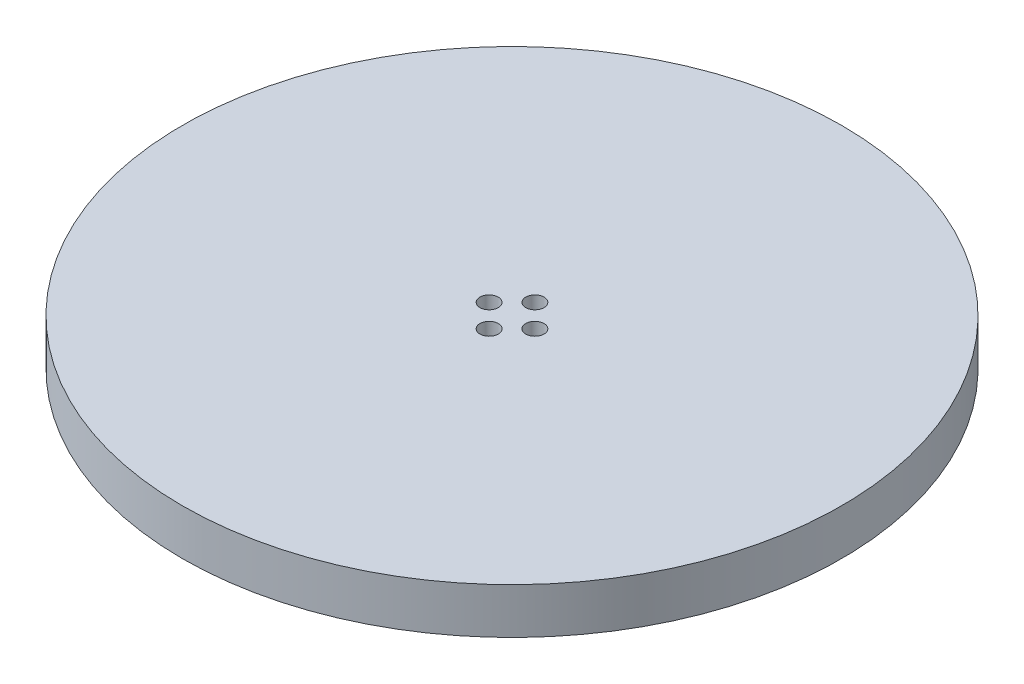
ISO-10303-21;
HEADER;
FILE_DESCRIPTION(('STEP AP214'),'2;1');
FILE_NAME('part.step','',(''),(''),'','','');
FILE_SCHEMA(('AUTOMOTIVE_DESIGN { 1 0 10303 214 1 1 1 1 }'));
ENDSEC;
DATA;
#1=APPLICATION_CONTEXT('core data for automotive mechanical design processes');
#2=APPLICATION_PROTOCOL_DEFINITION('international standard','automotive_design',2000,#1);
#3=PRODUCT_CONTEXT('',#1,'mechanical');
#4=PRODUCT('Part','Part','',(#3));
#5=PRODUCT_RELATED_PRODUCT_CATEGORY('part','',(#4));
#6=PRODUCT_DEFINITION_FORMATION('','',#4);
#7=PRODUCT_DEFINITION_CONTEXT('part definition',#1,'design');
#8=PRODUCT_DEFINITION('design','',#6,#7);
#9=PRODUCT_DEFINITION_SHAPE('','',#8);
#10=(LENGTH_UNIT() NAMED_UNIT(*) SI_UNIT(.MILLI.,.METRE.));
#11=(NAMED_UNIT(*) PLANE_ANGLE_UNIT() SI_UNIT($,.RADIAN.));
#12=(NAMED_UNIT(*) SI_UNIT($,.STERADIAN.) SOLID_ANGLE_UNIT());
#13=UNCERTAINTY_MEASURE_WITH_UNIT(LENGTH_MEASURE(1.E-05),#10,'distance_accuracy_value','');
#14=(GEOMETRIC_REPRESENTATION_CONTEXT(3) GLOBAL_UNCERTAINTY_ASSIGNED_CONTEXT((#13)) GLOBAL_UNIT_ASSIGNED_CONTEXT((#10,
#11,#12)) REPRESENTATION_CONTEXT('',''));
#15=CARTESIAN_POINT('',(0.,0.,0.));
#16=DIRECTION('',(0.,0.,1.));
#17=DIRECTION('',(1.,0.,0.));
#18=AXIS2_PLACEMENT_3D('',#15,#16,#17);
#19=CARTESIAN_POINT('',(-5.,10.,0.));
#20=DIRECTION('',(0.,-1.,0.));
#21=DIRECTION('',(0.,0.,-1.));
#22=AXIS2_PLACEMENT_3D('',#19,#20,#21);
#23=CYLINDRICAL_SURFACE('',#22,2.);
#24=CARTESIAN_POINT('',(-5.,10.,0.));
#25=DIRECTION('',(0.,1.,0.));
#26=DIRECTION('',(0.,0.,1.));
#27=AXIS2_PLACEMENT_3D('',#24,#25,#26);
#28=CIRCLE('',#27,2.);
#29=CARTESIAN_POINT('',(-5.,10.,2.));
#30=VERTEX_POINT('',#29);
#31=EDGE_CURVE('E39',#30,#30,#28,.T.);
#32=ORIENTED_EDGE('',*,*,#31,.T.);
#33=EDGE_LOOP('',(#32));
#34=FACE_BOUND('',#33,.T.);
#35=CARTESIAN_POINT('',(-5.,0.,0.));
#36=DIRECTION('',(0.,1.,0.));
#37=DIRECTION('',(0.,0.,1.));
#38=AXIS2_PLACEMENT_3D('',#35,#36,#37);
#39=CIRCLE('',#38,2.);
#40=CARTESIAN_POINT('',(-5.,0.,2.));
#41=VERTEX_POINT('',#40);
#42=EDGE_CURVE('E56',#41,#41,#39,.T.);
#43=ORIENTED_EDGE('',*,*,#42,.F.);
#44=EDGE_LOOP('',(#43));
#45=FACE_BOUND('',#44,.T.);
#46=ADVANCED_FACE('F31',(#34,#45),#23,.F.);
#47=CARTESIAN_POINT('',(0.,10.,0.));
#48=DIRECTION('',(0.,-1.,0.));
#49=DIRECTION('',(0.,0.,-1.));
#50=AXIS2_PLACEMENT_3D('',#47,#48,#49);
#51=CYLINDRICAL_SURFACE('',#50,72.);
#52=CARTESIAN_POINT('',(0.,10.,0.));
#53=DIRECTION('',(0.,1.,0.));
#54=DIRECTION('',(0.,0.,1.));
#55=AXIS2_PLACEMENT_3D('',#52,#53,#54);
#56=CIRCLE('',#55,72.);
#57=CARTESIAN_POINT('',(0.,10.,72.));
#58=VERTEX_POINT('',#57);
#59=EDGE_CURVE('E44',#58,#58,#56,.T.);
#60=ORIENTED_EDGE('',*,*,#59,.F.);
#61=EDGE_LOOP('',(#60));
#62=FACE_BOUND('',#61,.T.);
#63=CARTESIAN_POINT('',(0.,0.,0.));
#64=DIRECTION('',(0.,1.,0.));
#65=DIRECTION('',(0.,0.,1.));
#66=AXIS2_PLACEMENT_3D('',#63,#64,#65);
#67=CIRCLE('',#66,72.);
#68=CARTESIAN_POINT('',(0.,0.,72.));
#69=VERTEX_POINT('',#68);
#70=EDGE_CURVE('E54',#69,#69,#67,.T.);
#71=ORIENTED_EDGE('',*,*,#70,.T.);
#72=EDGE_LOOP('',(#71));
#73=FACE_BOUND('',#72,.T.);
#74=ADVANCED_FACE('F77',(#62,#73),#51,.T.);
#75=CARTESIAN_POINT('',(0.,10.,5.));
#76=DIRECTION('',(0.,-1.,0.));
#77=DIRECTION('',(0.,0.,-1.));
#78=AXIS2_PLACEMENT_3D('',#75,#76,#77);
#79=CYLINDRICAL_SURFACE('',#78,2.);
#80=CARTESIAN_POINT('',(0.,10.,5.));
#81=DIRECTION('',(0.,1.,0.));
#82=DIRECTION('',(0.,0.,1.));
#83=AXIS2_PLACEMENT_3D('',#80,#81,#82);
#84=CIRCLE('',#83,2.);
#85=CARTESIAN_POINT('',(0.,10.,7.));
#86=VERTEX_POINT('',#85);
#87=EDGE_CURVE('E65',#86,#86,#84,.T.);
#88=ORIENTED_EDGE('',*,*,#87,.T.);
#89=EDGE_LOOP('',(#88));
#90=FACE_BOUND('',#89,.T.);
#91=CARTESIAN_POINT('',(0.,0.,5.));
#92=DIRECTION('',(0.,1.,0.));
#93=DIRECTION('',(0.,0.,1.));
#94=AXIS2_PLACEMENT_3D('',#91,#92,#93);
#95=CIRCLE('',#94,2.);
#96=CARTESIAN_POINT('',(0.,0.,7.));
#97=VERTEX_POINT('',#96);
#98=EDGE_CURVE('E51',#97,#97,#95,.T.);
#99=ORIENTED_EDGE('',*,*,#98,.F.);
#100=EDGE_LOOP('',(#99));
#101=FACE_BOUND('',#100,.T.);
#102=ADVANCED_FACE('F80',(#90,#101),#79,.F.);
#103=CARTESIAN_POINT('',(0.,10.,-5.));
#104=DIRECTION('',(0.,-1.,0.));
#105=DIRECTION('',(0.,0.,-1.));
#106=AXIS2_PLACEMENT_3D('',#103,#104,#105);
#107=CYLINDRICAL_SURFACE('',#106,2.);
#108=CARTESIAN_POINT('',(0.,10.,-5.));
#109=DIRECTION('',(0.,1.,0.));
#110=DIRECTION('',(0.,0.,1.));
#111=AXIS2_PLACEMENT_3D('',#108,#109,#110);
#112=CIRCLE('',#111,2.);
#113=CARTESIAN_POINT('',(0.,10.,-3.));
#114=VERTEX_POINT('',#113);
#115=EDGE_CURVE('E61',#114,#114,#112,.T.);
#116=ORIENTED_EDGE('',*,*,#115,.T.);
#117=EDGE_LOOP('',(#116));
#118=FACE_BOUND('',#117,.T.);
#119=CARTESIAN_POINT('',(0.,0.,-5.));
#120=DIRECTION('',(0.,1.,0.));
#121=DIRECTION('',(0.,0.,1.));
#122=AXIS2_PLACEMENT_3D('',#119,#120,#121);
#123=CIRCLE('',#122,2.);
#124=CARTESIAN_POINT('',(0.,0.,-3.));
#125=VERTEX_POINT('',#124);
#126=EDGE_CURVE('E48',#125,#125,#123,.T.);
#127=ORIENTED_EDGE('',*,*,#126,.F.);
#128=EDGE_LOOP('',(#127));
#129=FACE_BOUND('',#128,.T.);
#130=ADVANCED_FACE('F33',(#118,#129),#107,.F.);
#131=CARTESIAN_POINT('',(5.,10.,0.));
#132=DIRECTION('',(0.,-1.,0.));
#133=DIRECTION('',(0.,0.,-1.));
#134=AXIS2_PLACEMENT_3D('',#131,#132,#133);
#135=CYLINDRICAL_SURFACE('',#134,2.);
#136=CARTESIAN_POINT('',(5.,10.,0.));
#137=DIRECTION('',(0.,1.,0.));
#138=DIRECTION('',(0.,0.,1.));
#139=AXIS2_PLACEMENT_3D('',#136,#137,#138);
#140=CIRCLE('',#139,2.);
#141=CARTESIAN_POINT('',(5.,10.,2.));
#142=VERTEX_POINT('',#141);
#143=EDGE_CURVE('E10',#142,#142,#140,.F.);
#144=ORIENTED_EDGE('',*,*,#143,.F.);
#145=EDGE_LOOP('',(#144));
#146=FACE_BOUND('',#145,.T.);
#147=CARTESIAN_POINT('',(5.,0.,0.));
#148=DIRECTION('',(0.,1.,0.));
#149=DIRECTION('',(0.,0.,1.));
#150=AXIS2_PLACEMENT_3D('',#147,#148,#149);
#151=CIRCLE('',#150,2.);
#152=CARTESIAN_POINT('',(5.,0.,2.));
#153=VERTEX_POINT('',#152);
#154=EDGE_CURVE('E35',#153,#153,#151,.F.);
#155=ORIENTED_EDGE('',*,*,#154,.T.);
#156=EDGE_LOOP('',(#155));
#157=FACE_BOUND('',#156,.T.);
#158=ADVANCED_FACE('F92',(#146,#157),#135,.F.);
#159=CARTESIAN_POINT('',(0.,10.,0.));
#160=DIRECTION('',(0.,1.,0.));
#161=DIRECTION('',(0.,0.,1.));
#162=AXIS2_PLACEMENT_3D('',#159,#160,#161);
#163=PLANE('',#162);
#164=ORIENTED_EDGE('',*,*,#115,.F.);
#165=EDGE_LOOP('',(#164));
#166=FACE_BOUND('',#165,.T.);
#167=ORIENTED_EDGE('',*,*,#87,.F.);
#168=EDGE_LOOP('',(#167));
#169=FACE_BOUND('',#168,.T.);
#170=ORIENTED_EDGE('',*,*,#59,.T.);
#171=EDGE_LOOP('',(#170));
#172=FACE_BOUND('',#171,.T.);
#173=ORIENTED_EDGE('',*,*,#31,.F.);
#174=EDGE_LOOP('',(#173));
#175=FACE_BOUND('',#174,.T.);
#176=ORIENTED_EDGE('',*,*,#143,.T.);
#177=EDGE_LOOP('',(#176));
#178=FACE_BOUND('',#177,.T.);
#179=ADVANCED_FACE('F74',(#166,#169,#172,#175,#178),#163,.T.);
#180=CARTESIAN_POINT('',(0.,0.,0.));
#181=DIRECTION('',(0.,1.,0.));
#182=DIRECTION('',(0.,0.,1.));
#183=AXIS2_PLACEMENT_3D('',#180,#181,#182);
#184=PLANE('',#183);
#185=ORIENTED_EDGE('',*,*,#126,.T.);
#186=EDGE_LOOP('',(#185));
#187=FACE_BOUND('',#186,.T.);
#188=ORIENTED_EDGE('',*,*,#98,.T.);
#189=EDGE_LOOP('',(#188));
#190=FACE_BOUND('',#189,.T.);
#191=ORIENTED_EDGE('',*,*,#70,.F.);
#192=EDGE_LOOP('',(#191));
#193=FACE_BOUND('',#192,.T.);
#194=ORIENTED_EDGE('',*,*,#42,.T.);
#195=EDGE_LOOP('',(#194));
#196=FACE_BOUND('',#195,.T.);
#197=ORIENTED_EDGE('',*,*,#154,.F.);
#198=EDGE_LOOP('',(#197));
#199=FACE_BOUND('',#198,.T.);
#200=ADVANCED_FACE('F84',(#187,#190,#193,#196,#199),#184,.F.);
#201=CLOSED_SHELL('',(#46,#74,#102,#130,#158,#179,#200));
#202=MANIFOLD_SOLID_BREP('B2',#201);
#203=ADVANCED_BREP_SHAPE_REPRESENTATION('',(#18,#202),#14);
#204=SHAPE_DEFINITION_REPRESENTATION(#9,#203);
ENDSEC;
END-ISO-10303-21;
